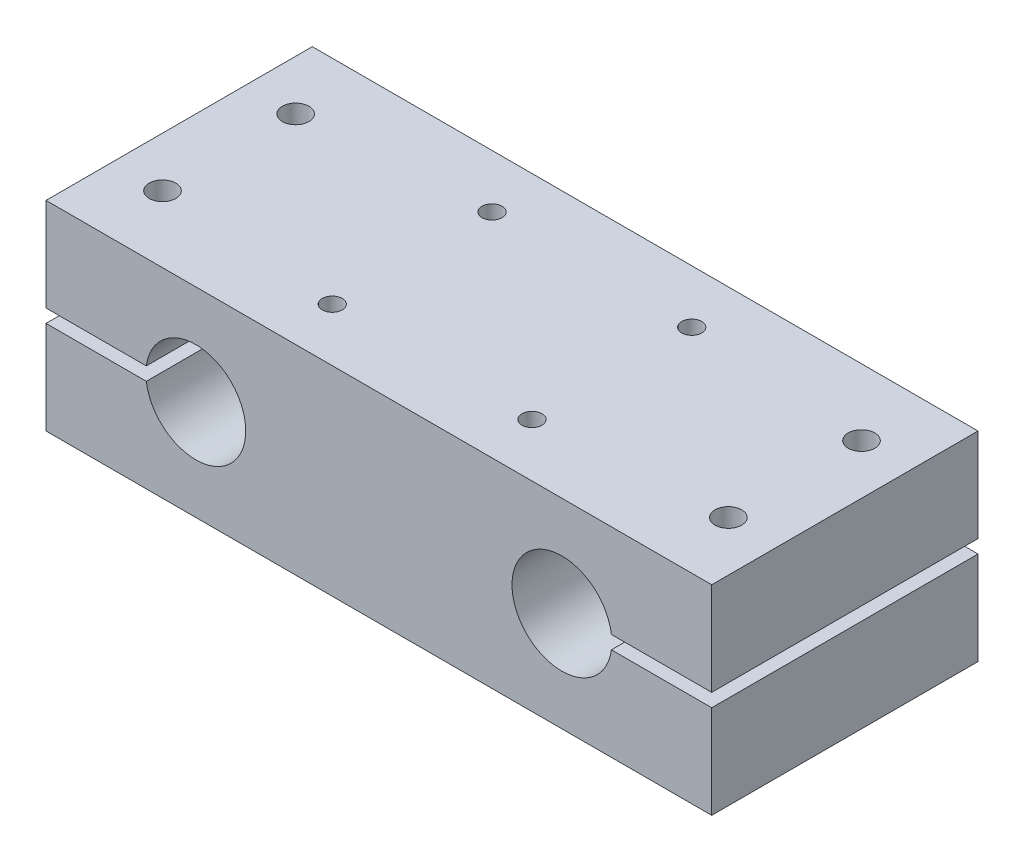
ISO-10303-21;
HEADER;
FILE_DESCRIPTION(('STEP AP214'),'2;1');
FILE_NAME('part.step','',(''),(''),'','','');
FILE_SCHEMA(('AUTOMOTIVE_DESIGN { 1 0 10303 214 1 1 1 1 }'));
ENDSEC;
DATA;
#1=APPLICATION_CONTEXT('core data for automotive mechanical design processes');
#2=APPLICATION_PROTOCOL_DEFINITION('international standard','automotive_design',2000,#1);
#3=PRODUCT_CONTEXT('',#1,'mechanical');
#4=PRODUCT('Part','Part','',(#3));
#5=PRODUCT_RELATED_PRODUCT_CATEGORY('part','',(#4));
#6=PRODUCT_DEFINITION_FORMATION('','',#4);
#7=PRODUCT_DEFINITION_CONTEXT('part definition',#1,'design');
#8=PRODUCT_DEFINITION('design','',#6,#7);
#9=PRODUCT_DEFINITION_SHAPE('','',#8);
#10=(LENGTH_UNIT() NAMED_UNIT(*) SI_UNIT(.MILLI.,.METRE.));
#11=(NAMED_UNIT(*) PLANE_ANGLE_UNIT() SI_UNIT($,.RADIAN.));
#12=(NAMED_UNIT(*) SI_UNIT($,.STERADIAN.) SOLID_ANGLE_UNIT());
#13=UNCERTAINTY_MEASURE_WITH_UNIT(LENGTH_MEASURE(1.E-05),#10,'distance_accuracy_value','');
#14=(GEOMETRIC_REPRESENTATION_CONTEXT(3) GLOBAL_UNCERTAINTY_ASSIGNED_CONTEXT((#13)) GLOBAL_UNIT_ASSIGNED_CONTEXT((#10,
#11,#12)) REPRESENTATION_CONTEXT('',''));
#15=CARTESIAN_POINT('',(0.,0.,0.));
#16=DIRECTION('',(0.,0.,1.));
#17=DIRECTION('',(1.,0.,0.));
#18=AXIS2_PLACEMENT_3D('',#15,#16,#17);
#19=CARTESIAN_POINT('',(0.,0.,40.));
#20=DIRECTION('',(1.,0.,0.));
#21=DIRECTION('',(0.,1.,0.));
#22=AXIS2_PLACEMENT_3D('',#19,#20,#21);
#23=PLANE('',#22);
#24=DIRECTION('',(0.,-1.,0.));
#25=VECTOR('',#24,1.);
#26=CARTESIAN_POINT('',(0.,0.,0.));
#27=LINE('',#26,#25);
#28=CARTESIAN_POINT('',(0.,14.,0.));
#29=VERTEX_POINT('',#28);
#30=CARTESIAN_POINT('',(0.,0.,0.));
#31=VERTEX_POINT('',#30);
#32=EDGE_CURVE('E157',#29,#31,#27,.T.);
#33=ORIENTED_EDGE('',*,*,#32,.T.);
#34=DIRECTION('',(0.,0.,-1.));
#35=VECTOR('',#34,1.);
#36=CARTESIAN_POINT('',(0.,0.,40.));
#37=LINE('',#36,#35);
#38=CARTESIAN_POINT('',(0.,0.,40.));
#39=VERTEX_POINT('',#38);
#40=EDGE_CURVE('E11',#39,#31,#37,.T.);
#41=ORIENTED_EDGE('',*,*,#40,.F.);
#42=DIRECTION('',(0.,-1.,0.));
#43=VECTOR('',#42,1.);
#44=CARTESIAN_POINT('',(0.,0.,40.));
#45=LINE('',#44,#43);
#46=CARTESIAN_POINT('',(0.,14.,40.));
#47=VERTEX_POINT('',#46);
#48=EDGE_CURVE('E180',#47,#39,#45,.T.);
#49=ORIENTED_EDGE('',*,*,#48,.F.);
#50=DIRECTION('',(0.,0.,-1.));
#51=VECTOR('',#50,1.);
#52=CARTESIAN_POINT('',(0.,14.,40.));
#53=LINE('',#52,#51);
#54=EDGE_CURVE('E153',#47,#29,#53,.T.);
#55=ORIENTED_EDGE('',*,*,#54,.T.);
#56=EDGE_LOOP('',(#33,#41,#49,#55));
#57=FACE_BOUND('',#56,.T.);
#58=ADVANCED_FACE('F35',(#57),#23,.F.);
#59=CARTESIAN_POINT('',(0.,0.,40.));
#60=DIRECTION('',(0.,1.,0.));
#61=DIRECTION('',(0.,0.,1.));
#62=AXIS2_PLACEMENT_3D('',#59,#60,#61);
#63=PLANE('',#62);
#64=CARTESIAN_POINT('',(65.,0.,32.));
#65=DIRECTION('',(0.,-1.,0.));
#66=DIRECTION('',(0.,0.,-1.));
#67=AXIS2_PLACEMENT_3D('',#64,#65,#66);
#68=CIRCLE('',#67,1.5);
#69=CARTESIAN_POINT('',(65.,0.,30.5));
#70=VERTEX_POINT('',#69);
#71=EDGE_CURVE('E438',#70,#70,#68,.T.);
#72=ORIENTED_EDGE('',*,*,#71,.F.);
#73=EDGE_LOOP('',(#72));
#74=FACE_BOUND('',#73,.T.);
#75=CARTESIAN_POINT('',(65.,0.,8.));
#76=DIRECTION('',(0.,-1.,0.));
#77=DIRECTION('',(0.,0.,-1.));
#78=AXIS2_PLACEMENT_3D('',#75,#76,#77);
#79=CIRCLE('',#78,1.5);
#80=CARTESIAN_POINT('',(65.,0.,6.5));
#81=VERTEX_POINT('',#80);
#82=EDGE_CURVE('E442',#81,#81,#79,.T.);
#83=ORIENTED_EDGE('',*,*,#82,.F.);
#84=EDGE_LOOP('',(#83));
#85=FACE_BOUND('',#84,.T.);
#86=CARTESIAN_POINT('',(35.,0.,8.));
#87=DIRECTION('',(0.,-1.,0.));
#88=DIRECTION('',(0.,0.,-1.));
#89=AXIS2_PLACEMENT_3D('',#86,#87,#88);
#90=CIRCLE('',#89,1.5);
#91=CARTESIAN_POINT('',(35.,0.,6.5));
#92=VERTEX_POINT('',#91);
#93=EDGE_CURVE('E449',#92,#92,#90,.T.);
#94=ORIENTED_EDGE('',*,*,#93,.F.);
#95=EDGE_LOOP('',(#94));
#96=FACE_BOUND('',#95,.T.);
#97=CARTESIAN_POINT('',(35.,0.,32.));
#98=DIRECTION('',(0.,-1.,0.));
#99=DIRECTION('',(0.,0.,-1.));
#100=AXIS2_PLACEMENT_3D('',#97,#98,#99);
#101=CIRCLE('',#100,1.5);
#102=CARTESIAN_POINT('',(35.,0.,30.5));
#103=VERTEX_POINT('',#102);
#104=EDGE_CURVE('E455',#103,#103,#101,.T.);
#105=ORIENTED_EDGE('',*,*,#104,.F.);
#106=EDGE_LOOP('',(#105));
#107=FACE_BOUND('',#106,.T.);
#108=CARTESIAN_POINT('',(92.5,0.,30.));
#109=DIRECTION('',(0.,-1.,0.));
#110=DIRECTION('',(0.,0.,-1.));
#111=AXIS2_PLACEMENT_3D('',#108,#109,#110);
#112=CIRCLE('',#111,2.);
#113=CARTESIAN_POINT('',(92.5,0.,28.));
#114=VERTEX_POINT('',#113);
#115=EDGE_CURVE('E461',#114,#114,#112,.T.);
#116=ORIENTED_EDGE('',*,*,#115,.F.);
#117=EDGE_LOOP('',(#116));
#118=FACE_BOUND('',#117,.T.);
#119=CARTESIAN_POINT('',(92.5,0.,10.));
#120=DIRECTION('',(0.,-1.,0.));
#121=DIRECTION('',(0.,0.,-1.));
#122=AXIS2_PLACEMENT_3D('',#119,#120,#121);
#123=CIRCLE('',#122,2.);
#124=CARTESIAN_POINT('',(92.5,0.,8.));
#125=VERTEX_POINT('',#124);
#126=EDGE_CURVE('E473',#125,#125,#123,.T.);
#127=ORIENTED_EDGE('',*,*,#126,.F.);
#128=EDGE_LOOP('',(#127));
#129=FACE_BOUND('',#128,.T.);
#130=CARTESIAN_POINT('',(7.5,0.,10.));
#131=DIRECTION('',(0.,-1.,0.));
#132=DIRECTION('',(0.,0.,-1.));
#133=AXIS2_PLACEMENT_3D('',#130,#131,#132);
#134=CIRCLE('',#133,2.);
#135=CARTESIAN_POINT('',(7.5,0.,8.));
#136=VERTEX_POINT('',#135);
#137=EDGE_CURVE('E485',#136,#136,#134,.T.);
#138=ORIENTED_EDGE('',*,*,#137,.F.);
#139=EDGE_LOOP('',(#138));
#140=FACE_BOUND('',#139,.T.);
#141=CARTESIAN_POINT('',(7.5,0.,30.));
#142=DIRECTION('',(0.,-1.,0.));
#143=DIRECTION('',(0.,0.,-1.));
#144=AXIS2_PLACEMENT_3D('',#141,#142,#143);
#145=CIRCLE('',#144,2.);
#146=CARTESIAN_POINT('',(7.5,0.,28.));
#147=VERTEX_POINT('',#146);
#148=EDGE_CURVE('E211',#147,#147,#145,.T.);
#149=ORIENTED_EDGE('',*,*,#148,.F.);
#150=EDGE_LOOP('',(#149));
#151=FACE_BOUND('',#150,.T.);
#152=DIRECTION('',(1.,0.,0.));
#153=VECTOR('',#152,1.);
#154=CARTESIAN_POINT('',(0.,0.,0.));
#155=LINE('',#154,#153);
#156=CARTESIAN_POINT('',(100.,0.,0.));
#157=VERTEX_POINT('',#156);
#158=EDGE_CURVE('E160',#31,#157,#155,.T.);
#159=ORIENTED_EDGE('',*,*,#158,.T.);
#160=DIRECTION('',(0.,0.,-1.));
#161=VECTOR('',#160,1.);
#162=CARTESIAN_POINT('',(100.,0.,40.));
#163=LINE('',#162,#161);
#164=CARTESIAN_POINT('',(100.,0.,40.));
#165=VERTEX_POINT('',#164);
#166=EDGE_CURVE('E44',#165,#157,#163,.T.);
#167=ORIENTED_EDGE('',*,*,#166,.F.);
#168=DIRECTION('',(1.,0.,0.));
#169=VECTOR('',#168,1.);
#170=CARTESIAN_POINT('',(0.,0.,40.));
#171=LINE('',#170,#169);
#172=EDGE_CURVE('E108',#39,#165,#171,.T.);
#173=ORIENTED_EDGE('',*,*,#172,.F.);
#174=ORIENTED_EDGE('',*,*,#40,.T.);
#175=EDGE_LOOP('',(#159,#167,#173,#174));
#176=FACE_BOUND('',#175,.T.);
#177=ADVANCED_FACE('F264',(#74,#85,#96,#107,#118,#129,#140,#151,#176),#63,.F.);
#178=CARTESIAN_POINT('',(100.,0.,40.));
#179=DIRECTION('',(-1.,0.,0.));
#180=DIRECTION('',(0.,0.,1.));
#181=AXIS2_PLACEMENT_3D('',#178,#179,#180);
#182=PLANE('',#181);
#183=DIRECTION('',(0.,1.,0.));
#184=VECTOR('',#183,1.);
#185=CARTESIAN_POINT('',(100.,0.,0.));
#186=LINE('',#185,#184);
#187=CARTESIAN_POINT('',(100.,14.,0.));
#188=VERTEX_POINT('',#187);
#189=EDGE_CURVE('E163',#157,#188,#186,.T.);
#190=ORIENTED_EDGE('',*,*,#189,.T.);
#191=DIRECTION('',(0.,0.,-1.));
#192=VECTOR('',#191,1.);
#193=CARTESIAN_POINT('',(100.,14.,40.));
#194=LINE('',#193,#192);
#195=CARTESIAN_POINT('',(100.,14.,40.));
#196=VERTEX_POINT('',#195);
#197=EDGE_CURVE('E199',#196,#188,#194,.T.);
#198=ORIENTED_EDGE('',*,*,#197,.F.);
#199=DIRECTION('',(0.,1.,0.));
#200=VECTOR('',#199,1.);
#201=CARTESIAN_POINT('',(100.,0.,40.));
#202=LINE('',#201,#200);
#203=EDGE_CURVE('E223',#165,#196,#202,.T.);
#204=ORIENTED_EDGE('',*,*,#203,.F.);
#205=ORIENTED_EDGE('',*,*,#166,.T.);
#206=EDGE_LOOP('',(#190,#198,#204,#205));
#207=FACE_BOUND('',#206,.T.);
#208=ADVANCED_FACE('F268',(#207),#182,.F.);
#209=CARTESIAN_POINT('',(100.,14.,40.));
#210=DIRECTION('',(0.,-1.,0.));
#211=DIRECTION('',(0.,0.,-1.));
#212=AXIS2_PLACEMENT_3D('',#209,#210,#211);
#213=PLANE('',#212);
#214=CARTESIAN_POINT('',(92.5,14.,30.));
#215=DIRECTION('',(0.,-1.,0.));
#216=DIRECTION('',(0.,0.,-1.));
#217=AXIS2_PLACEMENT_3D('',#214,#215,#216);
#218=CIRCLE('',#217,2.);
#219=CARTESIAN_POINT('',(92.5,14.,28.));
#220=VERTEX_POINT('',#219);
#221=EDGE_CURVE('E469',#220,#220,#218,.T.);
#222=ORIENTED_EDGE('',*,*,#221,.T.);
#223=EDGE_LOOP('',(#222));
#224=FACE_BOUND('',#223,.T.);
#225=CARTESIAN_POINT('',(92.5,14.,10.));
#226=DIRECTION('',(0.,-1.,0.));
#227=DIRECTION('',(0.,0.,-1.));
#228=AXIS2_PLACEMENT_3D('',#225,#226,#227);
#229=CIRCLE('',#228,2.);
#230=CARTESIAN_POINT('',(92.5,14.,8.));
#231=VERTEX_POINT('',#230);
#232=EDGE_CURVE('E481',#231,#231,#229,.T.);
#233=ORIENTED_EDGE('',*,*,#232,.T.);
#234=EDGE_LOOP('',(#233));
#235=FACE_BOUND('',#234,.T.);
#236=DIRECTION('',(-1.,0.,0.));
#237=VECTOR('',#236,1.);
#238=CARTESIAN_POINT('',(100.,14.,0.));
#239=LINE('',#238,#237);
#240=CARTESIAN_POINT('',(84.9330343736593,14.,0.));
#241=VERTEX_POINT('',#240);
#242=EDGE_CURVE('E165',#188,#241,#239,.T.);
#243=ORIENTED_EDGE('',*,*,#242,.T.);
#244=DIRECTION('',(0.,0.,-1.));
#245=VECTOR('',#244,1.);
#246=CARTESIAN_POINT('',(84.9330343736593,14.,40.));
#247=LINE('',#246,#245);
#248=CARTESIAN_POINT('',(84.9330343736593,14.,40.));
#249=VERTEX_POINT('',#248);
#250=EDGE_CURVE('E196',#249,#241,#247,.T.);
#251=ORIENTED_EDGE('',*,*,#250,.F.);
#252=DIRECTION('',(-1.,0.,0.));
#253=VECTOR('',#252,1.);
#254=CARTESIAN_POINT('',(100.,14.,40.));
#255=LINE('',#254,#253);
#256=EDGE_CURVE('E225',#196,#249,#255,.T.);
#257=ORIENTED_EDGE('',*,*,#256,.F.);
#258=ORIENTED_EDGE('',*,*,#197,.T.);
#259=EDGE_LOOP('',(#243,#251,#257,#258));
#260=FACE_BOUND('',#259,.T.);
#261=ADVANCED_FACE('F273',(#224,#235,#260),#213,.F.);
#262=CARTESIAN_POINT('',(77.5,15.,40.));
#263=DIRECTION('',(0.,0.,-1.));
#264=DIRECTION('',(-1.,0.,0.));
#265=AXIS2_PLACEMENT_3D('',#262,#263,#264);
#266=CYLINDRICAL_SURFACE('',#265,7.50000000000001);
#267=CARTESIAN_POINT('',(77.5,15.,0.));
#268=DIRECTION('',(0.,0.,-1.));
#269=DIRECTION('',(1.,0.,0.));
#270=AXIS2_PLACEMENT_3D('',#267,#268,#269);
#271=CIRCLE('',#270,7.50000000000001);
#272=CARTESIAN_POINT('',(84.9330343736593,16.,0.));
#273=VERTEX_POINT('',#272);
#274=EDGE_CURVE('E167',#241,#273,#271,.T.);
#275=ORIENTED_EDGE('',*,*,#274,.T.);
#276=DIRECTION('',(0.,0.,-1.));
#277=VECTOR('',#276,1.);
#278=CARTESIAN_POINT('',(84.9330343736593,16.,40.));
#279=LINE('',#278,#277);
#280=CARTESIAN_POINT('',(84.9330343736593,16.,40.));
#281=VERTEX_POINT('',#280);
#282=EDGE_CURVE('E193',#281,#273,#279,.T.);
#283=ORIENTED_EDGE('',*,*,#282,.F.);
#284=CARTESIAN_POINT('',(77.5,15.,40.));
#285=DIRECTION('',(0.,0.,-1.));
#286=DIRECTION('',(1.,0.,0.));
#287=AXIS2_PLACEMENT_3D('',#284,#285,#286);
#288=CIRCLE('',#287,7.50000000000001);
#289=EDGE_CURVE('E227',#249,#281,#288,.T.);
#290=ORIENTED_EDGE('',*,*,#289,.F.);
#291=ORIENTED_EDGE('',*,*,#250,.T.);
#292=EDGE_LOOP('',(#275,#283,#290,#291));
#293=FACE_BOUND('',#292,.T.);
#294=ADVANCED_FACE('F281',(#293),#266,.F.);
#295=CARTESIAN_POINT('',(100.,16.,40.));
#296=DIRECTION('',(0.,1.,0.));
#297=DIRECTION('',(0.,0.,1.));
#298=AXIS2_PLACEMENT_3D('',#295,#296,#297);
#299=PLANE('',#298);
#300=CARTESIAN_POINT('',(92.5,16.,30.));
#301=DIRECTION('',(0.,1.,0.));
#302=DIRECTION('',(0.,0.,1.));
#303=AXIS2_PLACEMENT_3D('',#300,#301,#302);
#304=CIRCLE('',#303,2.);
#305=CARTESIAN_POINT('',(92.5,16.,32.));
#306=VERTEX_POINT('',#305);
#307=EDGE_CURVE('E464',#306,#306,#304,.T.);
#308=ORIENTED_EDGE('',*,*,#307,.T.);
#309=EDGE_LOOP('',(#308));
#310=FACE_BOUND('',#309,.T.);
#311=CARTESIAN_POINT('',(92.5,16.,10.));
#312=DIRECTION('',(0.,1.,0.));
#313=DIRECTION('',(0.,0.,1.));
#314=AXIS2_PLACEMENT_3D('',#311,#312,#313);
#315=CIRCLE('',#314,2.);
#316=CARTESIAN_POINT('',(92.5,16.,12.));
#317=VERTEX_POINT('',#316);
#318=EDGE_CURVE('E476',#317,#317,#315,.T.);
#319=ORIENTED_EDGE('',*,*,#318,.T.);
#320=EDGE_LOOP('',(#319));
#321=FACE_BOUND('',#320,.T.);
#322=DIRECTION('',(1.,0.,0.));
#323=VECTOR('',#322,1.);
#324=CARTESIAN_POINT('',(100.,16.,0.));
#325=LINE('',#324,#323);
#326=CARTESIAN_POINT('',(100.,16.,0.));
#327=VERTEX_POINT('',#326);
#328=EDGE_CURVE('E169',#273,#327,#325,.T.);
#329=ORIENTED_EDGE('',*,*,#328,.T.);
#330=DIRECTION('',(0.,0.,-1.));
#331=VECTOR('',#330,1.);
#332=CARTESIAN_POINT('',(100.,16.,40.));
#333=LINE('',#332,#331);
#334=CARTESIAN_POINT('',(100.,16.,40.));
#335=VERTEX_POINT('',#334);
#336=EDGE_CURVE('E190',#335,#327,#333,.T.);
#337=ORIENTED_EDGE('',*,*,#336,.F.);
#338=DIRECTION('',(1.,0.,0.));
#339=VECTOR('',#338,1.);
#340=CARTESIAN_POINT('',(100.,16.,40.));
#341=LINE('',#340,#339);
#342=EDGE_CURVE('E229',#281,#335,#341,.T.);
#343=ORIENTED_EDGE('',*,*,#342,.F.);
#344=ORIENTED_EDGE('',*,*,#282,.T.);
#345=EDGE_LOOP('',(#329,#337,#343,#344));
#346=FACE_BOUND('',#345,.T.);
#347=ADVANCED_FACE('F285',(#310,#321,#346),#299,.F.);
#348=CARTESIAN_POINT('',(100.,16.,40.));
#349=DIRECTION('',(-1.,0.,0.));
#350=DIRECTION('',(0.,0.,1.));
#351=AXIS2_PLACEMENT_3D('',#348,#349,#350);
#352=PLANE('',#351);
#353=DIRECTION('',(0.,1.,0.));
#354=VECTOR('',#353,1.);
#355=CARTESIAN_POINT('',(100.,16.,0.));
#356=LINE('',#355,#354);
#357=CARTESIAN_POINT('',(100.,30.,0.));
#358=VERTEX_POINT('',#357);
#359=EDGE_CURVE('E171',#327,#358,#356,.T.);
#360=ORIENTED_EDGE('',*,*,#359,.T.);
#361=DIRECTION('',(0.,0.,-1.));
#362=VECTOR('',#361,1.);
#363=CARTESIAN_POINT('',(100.,30.,40.));
#364=LINE('',#363,#362);
#365=CARTESIAN_POINT('',(100.,30.,40.));
#366=VERTEX_POINT('',#365);
#367=EDGE_CURVE('E187',#366,#358,#364,.T.);
#368=ORIENTED_EDGE('',*,*,#367,.F.);
#369=DIRECTION('',(0.,1.,0.));
#370=VECTOR('',#369,1.);
#371=CARTESIAN_POINT('',(100.,16.,40.));
#372=LINE('',#371,#370);
#373=EDGE_CURVE('E231',#335,#366,#372,.T.);
#374=ORIENTED_EDGE('',*,*,#373,.F.);
#375=ORIENTED_EDGE('',*,*,#336,.T.);
#376=EDGE_LOOP('',(#360,#368,#374,#375));
#377=FACE_BOUND('',#376,.T.);
#378=ADVANCED_FACE('F289',(#377),#352,.F.);
#379=CARTESIAN_POINT('',(0.,30.,40.));
#380=DIRECTION('',(0.,-1.,0.));
#381=DIRECTION('',(0.,0.,-1.));
#382=AXIS2_PLACEMENT_3D('',#379,#380,#381);
#383=PLANE('',#382);
#384=CARTESIAN_POINT('',(65.,30.,32.));
#385=DIRECTION('',(0.,-1.,0.));
#386=DIRECTION('',(0.,0.,-1.));
#387=AXIS2_PLACEMENT_3D('',#384,#385,#386);
#388=CIRCLE('',#387,1.5);
#389=CARTESIAN_POINT('',(65.,30.,30.5));
#390=VERTEX_POINT('',#389);
#391=EDGE_CURVE('E436',#390,#390,#388,.T.);
#392=ORIENTED_EDGE('',*,*,#391,.T.);
#393=EDGE_LOOP('',(#392));
#394=FACE_BOUND('',#393,.T.);
#395=CARTESIAN_POINT('',(65.,30.,8.));
#396=DIRECTION('',(0.,-1.,0.));
#397=DIRECTION('',(0.,0.,-1.));
#398=AXIS2_PLACEMENT_3D('',#395,#396,#397);
#399=CIRCLE('',#398,1.5);
#400=CARTESIAN_POINT('',(65.,30.,6.5));
#401=VERTEX_POINT('',#400);
#402=EDGE_CURVE('E439',#401,#401,#399,.T.);
#403=ORIENTED_EDGE('',*,*,#402,.T.);
#404=EDGE_LOOP('',(#403));
#405=FACE_BOUND('',#404,.T.);
#406=CARTESIAN_POINT('',(35.,30.,8.));
#407=DIRECTION('',(0.,-1.,0.));
#408=DIRECTION('',(0.,0.,-1.));
#409=AXIS2_PLACEMENT_3D('',#406,#407,#408);
#410=CIRCLE('',#409,1.5);
#411=CARTESIAN_POINT('',(35.,30.,6.5));
#412=VERTEX_POINT('',#411);
#413=EDGE_CURVE('E447',#412,#412,#410,.T.);
#414=ORIENTED_EDGE('',*,*,#413,.T.);
#415=EDGE_LOOP('',(#414));
#416=FACE_BOUND('',#415,.T.);
#417=CARTESIAN_POINT('',(35.,30.,32.));
#418=DIRECTION('',(0.,-1.,0.));
#419=DIRECTION('',(0.,0.,-1.));
#420=AXIS2_PLACEMENT_3D('',#417,#418,#419);
#421=CIRCLE('',#420,1.5);
#422=CARTESIAN_POINT('',(35.,30.,30.5));
#423=VERTEX_POINT('',#422);
#424=EDGE_CURVE('E452',#423,#423,#421,.T.);
#425=ORIENTED_EDGE('',*,*,#424,.T.);
#426=EDGE_LOOP('',(#425));
#427=FACE_BOUND('',#426,.T.);
#428=CARTESIAN_POINT('',(92.5,30.,30.));
#429=DIRECTION('',(0.,-1.,0.));
#430=DIRECTION('',(0.,0.,-1.));
#431=AXIS2_PLACEMENT_3D('',#428,#429,#430);
#432=CIRCLE('',#431,2.);
#433=CARTESIAN_POINT('',(92.5,30.,28.));
#434=VERTEX_POINT('',#433);
#435=EDGE_CURVE('E458',#434,#434,#432,.T.);
#436=ORIENTED_EDGE('',*,*,#435,.T.);
#437=EDGE_LOOP('',(#436));
#438=FACE_BOUND('',#437,.T.);
#439=CARTESIAN_POINT('',(92.5,30.,10.));
#440=DIRECTION('',(0.,-1.,0.));
#441=DIRECTION('',(0.,0.,-1.));
#442=AXIS2_PLACEMENT_3D('',#439,#440,#441);
#443=CIRCLE('',#442,2.);
#444=CARTESIAN_POINT('',(92.5,30.,8.));
#445=VERTEX_POINT('',#444);
#446=EDGE_CURVE('E472',#445,#445,#443,.T.);
#447=ORIENTED_EDGE('',*,*,#446,.T.);
#448=EDGE_LOOP('',(#447));
#449=FACE_BOUND('',#448,.T.);
#450=CARTESIAN_POINT('',(7.5,30.,10.));
#451=DIRECTION('',(0.,-1.,0.));
#452=DIRECTION('',(0.,0.,-1.));
#453=AXIS2_PLACEMENT_3D('',#450,#451,#452);
#454=CIRCLE('',#453,2.);
#455=CARTESIAN_POINT('',(7.5,30.,8.));
#456=VERTEX_POINT('',#455);
#457=EDGE_CURVE('E484',#456,#456,#454,.T.);
#458=ORIENTED_EDGE('',*,*,#457,.T.);
#459=EDGE_LOOP('',(#458));
#460=FACE_BOUND('',#459,.T.);
#461=CARTESIAN_POINT('',(7.5,30.,30.));
#462=DIRECTION('',(0.,-1.,0.));
#463=DIRECTION('',(0.,0.,-1.));
#464=AXIS2_PLACEMENT_3D('',#461,#462,#463);
#465=CIRCLE('',#464,2.);
#466=CARTESIAN_POINT('',(7.5,30.,28.));
#467=VERTEX_POINT('',#466);
#468=EDGE_CURVE('E205',#467,#467,#465,.T.);
#469=ORIENTED_EDGE('',*,*,#468,.T.);
#470=EDGE_LOOP('',(#469));
#471=FACE_BOUND('',#470,.T.);
#472=DIRECTION('',(-1.,0.,0.));
#473=VECTOR('',#472,1.);
#474=CARTESIAN_POINT('',(0.,30.,0.));
#475=LINE('',#474,#473);
#476=CARTESIAN_POINT('',(0.,30.,0.));
#477=VERTEX_POINT('',#476);
#478=EDGE_CURVE('E173',#358,#477,#475,.T.);
#479=ORIENTED_EDGE('',*,*,#478,.T.);
#480=DIRECTION('',(0.,0.,-1.));
#481=VECTOR('',#480,1.);
#482=CARTESIAN_POINT('',(0.,30.,40.));
#483=LINE('',#482,#481);
#484=CARTESIAN_POINT('',(0.,30.,40.));
#485=VERTEX_POINT('',#484);
#486=EDGE_CURVE('E184',#485,#477,#483,.T.);
#487=ORIENTED_EDGE('',*,*,#486,.F.);
#488=DIRECTION('',(-1.,0.,0.));
#489=VECTOR('',#488,1.);
#490=CARTESIAN_POINT('',(0.,30.,40.));
#491=LINE('',#490,#489);
#492=EDGE_CURVE('E233',#366,#485,#491,.T.);
#493=ORIENTED_EDGE('',*,*,#492,.F.);
#494=ORIENTED_EDGE('',*,*,#367,.T.);
#495=EDGE_LOOP('',(#479,#487,#493,#494));
#496=FACE_BOUND('',#495,.T.);
#497=ADVANCED_FACE('F239',(#394,#405,#416,#427,#438,#449,#460,#471,#496),#383,.F.);
#498=CARTESIAN_POINT('',(0.,16.,40.));
#499=DIRECTION('',(1.,0.,0.));
#500=DIRECTION('',(0.,0.,-1.));
#501=AXIS2_PLACEMENT_3D('',#498,#499,#500);
#502=PLANE('',#501);
#503=DIRECTION('',(0.,-1.,0.));
#504=VECTOR('',#503,1.);
#505=CARTESIAN_POINT('',(0.,16.,0.));
#506=LINE('',#505,#504);
#507=CARTESIAN_POINT('',(0.,16.,0.));
#508=VERTEX_POINT('',#507);
#509=EDGE_CURVE('E175',#477,#508,#506,.T.);
#510=ORIENTED_EDGE('',*,*,#509,.T.);
#511=DIRECTION('',(0.,0.,-1.));
#512=VECTOR('',#511,1.);
#513=CARTESIAN_POINT('',(0.,16.,40.));
#514=LINE('',#513,#512);
#515=CARTESIAN_POINT('',(0.,16.,40.));
#516=VERTEX_POINT('',#515);
#517=EDGE_CURVE('E148',#516,#508,#514,.T.);
#518=ORIENTED_EDGE('',*,*,#517,.F.);
#519=DIRECTION('',(0.,-1.,0.));
#520=VECTOR('',#519,1.);
#521=CARTESIAN_POINT('',(0.,16.,40.));
#522=LINE('',#521,#520);
#523=EDGE_CURVE('E139',#485,#516,#522,.T.);
#524=ORIENTED_EDGE('',*,*,#523,.F.);
#525=ORIENTED_EDGE('',*,*,#486,.T.);
#526=EDGE_LOOP('',(#510,#518,#524,#525));
#527=FACE_BOUND('',#526,.T.);
#528=ADVANCED_FACE('F243',(#527),#502,.F.);
#529=CARTESIAN_POINT('',(0.,16.,40.));
#530=DIRECTION('',(0.,1.,0.));
#531=DIRECTION('',(0.,0.,1.));
#532=AXIS2_PLACEMENT_3D('',#529,#530,#531);
#533=PLANE('',#532);
#534=CARTESIAN_POINT('',(7.5,16.,10.));
#535=DIRECTION('',(0.,1.,0.));
#536=DIRECTION('',(0.,0.,1.));
#537=AXIS2_PLACEMENT_3D('',#534,#535,#536);
#538=CIRCLE('',#537,2.);
#539=CARTESIAN_POINT('',(7.5,16.,12.));
#540=VERTEX_POINT('',#539);
#541=EDGE_CURVE('E216',#540,#540,#538,.T.);
#542=ORIENTED_EDGE('',*,*,#541,.T.);
#543=EDGE_LOOP('',(#542));
#544=FACE_BOUND('',#543,.T.);
#545=CARTESIAN_POINT('',(7.5,16.,30.));
#546=DIRECTION('',(0.,1.,0.));
#547=DIRECTION('',(0.,0.,1.));
#548=AXIS2_PLACEMENT_3D('',#545,#546,#547);
#549=CIRCLE('',#548,2.);
#550=CARTESIAN_POINT('',(7.5,16.,32.));
#551=VERTEX_POINT('',#550);
#552=EDGE_CURVE('E161',#551,#551,#549,.T.);
#553=ORIENTED_EDGE('',*,*,#552,.T.);
#554=EDGE_LOOP('',(#553));
#555=FACE_BOUND('',#554,.T.);
#556=DIRECTION('',(1.,0.,0.));
#557=VECTOR('',#556,1.);
#558=CARTESIAN_POINT('',(0.,16.,0.));
#559=LINE('',#558,#557);
#560=CARTESIAN_POINT('',(15.0669656263407,16.,0.));
#561=VERTEX_POINT('',#560);
#562=EDGE_CURVE('E147',#508,#561,#559,.T.);
#563=ORIENTED_EDGE('',*,*,#562,.T.);
#564=DIRECTION('',(0.,0.,-1.));
#565=VECTOR('',#564,1.);
#566=CARTESIAN_POINT('',(15.0669656263407,16.,40.));
#567=LINE('',#566,#565);
#568=CARTESIAN_POINT('',(15.0669656263407,16.,40.));
#569=VERTEX_POINT('',#568);
#570=EDGE_CURVE('E144',#569,#561,#567,.T.);
#571=ORIENTED_EDGE('',*,*,#570,.F.);
#572=DIRECTION('',(1.,0.,0.));
#573=VECTOR('',#572,1.);
#574=CARTESIAN_POINT('',(0.,16.,40.));
#575=LINE('',#574,#573);
#576=EDGE_CURVE('E133',#516,#569,#575,.T.);
#577=ORIENTED_EDGE('',*,*,#576,.F.);
#578=ORIENTED_EDGE('',*,*,#517,.T.);
#579=EDGE_LOOP('',(#563,#571,#577,#578));
#580=FACE_BOUND('',#579,.T.);
#581=ADVANCED_FACE('F145',(#544,#555,#580),#533,.F.);
#582=CARTESIAN_POINT('',(22.5,15.,40.));
#583=DIRECTION('',(0.,0.,-1.));
#584=DIRECTION('',(-1.,0.,0.));
#585=AXIS2_PLACEMENT_3D('',#582,#583,#584);
#586=CYLINDRICAL_SURFACE('',#585,7.5);
#587=CARTESIAN_POINT('',(22.5,15.,0.));
#588=DIRECTION('',(0.,0.,-1.));
#589=DIRECTION('',(1.,0.,0.));
#590=AXIS2_PLACEMENT_3D('',#587,#588,#589);
#591=CIRCLE('',#590,7.5);
#592=CARTESIAN_POINT('',(15.0669656263407,14.,0.));
#593=VERTEX_POINT('',#592);
#594=EDGE_CURVE('E94',#561,#593,#591,.T.);
#595=ORIENTED_EDGE('',*,*,#594,.T.);
#596=DIRECTION('',(0.,0.,-1.));
#597=VECTOR('',#596,1.);
#598=CARTESIAN_POINT('',(15.0669656263407,14.,40.));
#599=LINE('',#598,#597);
#600=CARTESIAN_POINT('',(15.0669656263407,14.,40.));
#601=VERTEX_POINT('',#600);
#602=EDGE_CURVE('E149',#601,#593,#599,.T.);
#603=ORIENTED_EDGE('',*,*,#602,.F.);
#604=CARTESIAN_POINT('',(22.5,15.,40.));
#605=DIRECTION('',(0.,0.,-1.));
#606=DIRECTION('',(1.,0.,0.));
#607=AXIS2_PLACEMENT_3D('',#604,#605,#606);
#608=CIRCLE('',#607,7.5);
#609=EDGE_CURVE('E137',#569,#601,#608,.T.);
#610=ORIENTED_EDGE('',*,*,#609,.F.);
#611=ORIENTED_EDGE('',*,*,#570,.T.);
#612=EDGE_LOOP('',(#595,#603,#610,#611));
#613=FACE_BOUND('',#612,.T.);
#614=ADVANCED_FACE('F151',(#613),#586,.F.);
#615=CARTESIAN_POINT('',(0.,14.,40.));
#616=DIRECTION('',(0.,-1.,0.));
#617=DIRECTION('',(0.,0.,-1.));
#618=AXIS2_PLACEMENT_3D('',#615,#616,#617);
#619=PLANE('',#618);
#620=CARTESIAN_POINT('',(7.5,14.,10.));
#621=DIRECTION('',(0.,-1.,0.));
#622=DIRECTION('',(0.,0.,-1.));
#623=AXIS2_PLACEMENT_3D('',#620,#621,#622);
#624=CIRCLE('',#623,2.);
#625=CARTESIAN_POINT('',(7.5,14.,8.));
#626=VERTEX_POINT('',#625);
#627=EDGE_CURVE('E38',#626,#626,#624,.T.);
#628=ORIENTED_EDGE('',*,*,#627,.T.);
#629=EDGE_LOOP('',(#628));
#630=FACE_BOUND('',#629,.T.);
#631=CARTESIAN_POINT('',(7.5,14.,30.));
#632=DIRECTION('',(0.,-1.,0.));
#633=DIRECTION('',(0.,0.,-1.));
#634=AXIS2_PLACEMENT_3D('',#631,#632,#633);
#635=CIRCLE('',#634,2.);
#636=CARTESIAN_POINT('',(7.5,14.,28.));
#637=VERTEX_POINT('',#636);
#638=EDGE_CURVE('E203',#637,#637,#635,.T.);
#639=ORIENTED_EDGE('',*,*,#638,.T.);
#640=EDGE_LOOP('',(#639));
#641=FACE_BOUND('',#640,.T.);
#642=DIRECTION('',(-1.,0.,0.));
#643=VECTOR('',#642,1.);
#644=CARTESIAN_POINT('',(0.,14.,0.));
#645=LINE('',#644,#643);
#646=EDGE_CURVE('E100',#593,#29,#645,.T.);
#647=ORIENTED_EDGE('',*,*,#646,.T.);
#648=ORIENTED_EDGE('',*,*,#54,.F.);
#649=DIRECTION('',(-1.,0.,0.));
#650=VECTOR('',#649,1.);
#651=CARTESIAN_POINT('',(0.,14.,40.));
#652=LINE('',#651,#650);
#653=EDGE_CURVE('E53',#601,#47,#652,.T.);
#654=ORIENTED_EDGE('',*,*,#653,.F.);
#655=ORIENTED_EDGE('',*,*,#602,.T.);
#656=EDGE_LOOP('',(#647,#648,#654,#655));
#657=FACE_BOUND('',#656,.T.);
#658=ADVANCED_FACE('F251',(#630,#641,#657),#619,.F.);
#659=CARTESIAN_POINT('',(22.5,15.,40.));
#660=DIRECTION('',(0.,0.,1.));
#661=DIRECTION('',(1.,0.,0.));
#662=AXIS2_PLACEMENT_3D('',#659,#660,#661);
#663=PLANE('',#662);
#664=ORIENTED_EDGE('',*,*,#48,.T.);
#665=ORIENTED_EDGE('',*,*,#172,.T.);
#666=ORIENTED_EDGE('',*,*,#203,.T.);
#667=ORIENTED_EDGE('',*,*,#256,.T.);
#668=ORIENTED_EDGE('',*,*,#289,.T.);
#669=ORIENTED_EDGE('',*,*,#342,.T.);
#670=ORIENTED_EDGE('',*,*,#373,.T.);
#671=ORIENTED_EDGE('',*,*,#492,.T.);
#672=ORIENTED_EDGE('',*,*,#523,.T.);
#673=ORIENTED_EDGE('',*,*,#576,.T.);
#674=ORIENTED_EDGE('',*,*,#609,.T.);
#675=ORIENTED_EDGE('',*,*,#653,.T.);
#676=EDGE_LOOP('',(#664,#665,#666,#667,#668,#669,#670,#671,#672,#673,#674,#675));
#677=FACE_BOUND('',#676,.T.);
#678=ADVANCED_FACE('F135',(#677),#663,.T.);
#679=CARTESIAN_POINT('',(22.5,15.,0.));
#680=DIRECTION('',(0.,0.,1.));
#681=DIRECTION('',(1.,0.,0.));
#682=AXIS2_PLACEMENT_3D('',#679,#680,#681);
#683=PLANE('',#682);
#684=ORIENTED_EDGE('',*,*,#32,.F.);
#685=ORIENTED_EDGE('',*,*,#646,.F.);
#686=ORIENTED_EDGE('',*,*,#594,.F.);
#687=ORIENTED_EDGE('',*,*,#562,.F.);
#688=ORIENTED_EDGE('',*,*,#509,.F.);
#689=ORIENTED_EDGE('',*,*,#478,.F.);
#690=ORIENTED_EDGE('',*,*,#359,.F.);
#691=ORIENTED_EDGE('',*,*,#328,.F.);
#692=ORIENTED_EDGE('',*,*,#274,.F.);
#693=ORIENTED_EDGE('',*,*,#242,.F.);
#694=ORIENTED_EDGE('',*,*,#189,.F.);
#695=ORIENTED_EDGE('',*,*,#158,.F.);
#696=EDGE_LOOP('',(#684,#685,#686,#687,#688,#689,#690,#691,#692,#693,#694,#695));
#697=FACE_BOUND('',#696,.T.);
#698=ADVANCED_FACE('F246',(#697),#683,.F.);
#699=CARTESIAN_POINT('',(7.5,30.,30.));
#700=DIRECTION('',(0.,-1.,0.));
#701=DIRECTION('',(0.,0.,-1.));
#702=AXIS2_PLACEMENT_3D('',#699,#700,#701);
#703=CYLINDRICAL_SURFACE('',#702,2.);
#704=ORIENTED_EDGE('',*,*,#148,.T.);
#705=EDGE_LOOP('',(#704));
#706=FACE_BOUND('',#705,.T.);
#707=ORIENTED_EDGE('',*,*,#638,.F.);
#708=EDGE_LOOP('',(#707));
#709=FACE_BOUND('',#708,.T.);
#710=ADVANCED_FACE('F311',(#706,#709),#703,.F.);
#711=ORIENTED_EDGE('',*,*,#468,.F.);
#712=EDGE_LOOP('',(#711));
#713=FACE_BOUND('',#712,.T.);
#714=ORIENTED_EDGE('',*,*,#552,.F.);
#715=EDGE_LOOP('',(#714));
#716=FACE_BOUND('',#715,.T.);
#717=ADVANCED_FACE('F308',(#713,#716),#703,.F.);
#718=CARTESIAN_POINT('',(7.5,30.,10.));
#719=DIRECTION('',(0.,-1.,0.));
#720=DIRECTION('',(0.,0.,-1.));
#721=AXIS2_PLACEMENT_3D('',#718,#719,#720);
#722=CYLINDRICAL_SURFACE('',#721,2.);
#723=ORIENTED_EDGE('',*,*,#137,.T.);
#724=EDGE_LOOP('',(#723));
#725=FACE_BOUND('',#724,.T.);
#726=ORIENTED_EDGE('',*,*,#627,.F.);
#727=EDGE_LOOP('',(#726));
#728=FACE_BOUND('',#727,.T.);
#729=ADVANCED_FACE('F310',(#725,#728),#722,.F.);
#730=ORIENTED_EDGE('',*,*,#457,.F.);
#731=EDGE_LOOP('',(#730));
#732=FACE_BOUND('',#731,.T.);
#733=ORIENTED_EDGE('',*,*,#541,.F.);
#734=EDGE_LOOP('',(#733));
#735=FACE_BOUND('',#734,.T.);
#736=ADVANCED_FACE('F318',(#732,#735),#722,.F.);
#737=CARTESIAN_POINT('',(92.5,30.,10.));
#738=DIRECTION('',(0.,-1.,0.));
#739=DIRECTION('',(0.,0.,-1.));
#740=AXIS2_PLACEMENT_3D('',#737,#738,#739);
#741=CYLINDRICAL_SURFACE('',#740,2.);
#742=ORIENTED_EDGE('',*,*,#446,.F.);
#743=EDGE_LOOP('',(#742));
#744=FACE_BOUND('',#743,.T.);
#745=ORIENTED_EDGE('',*,*,#318,.F.);
#746=EDGE_LOOP('',(#745));
#747=FACE_BOUND('',#746,.T.);
#748=ADVANCED_FACE('F353',(#744,#747),#741,.F.);
#749=ORIENTED_EDGE('',*,*,#126,.T.);
#750=EDGE_LOOP('',(#749));
#751=FACE_BOUND('',#750,.T.);
#752=ORIENTED_EDGE('',*,*,#232,.F.);
#753=EDGE_LOOP('',(#752));
#754=FACE_BOUND('',#753,.T.);
#755=ADVANCED_FACE('F362',(#751,#754),#741,.F.);
#756=CARTESIAN_POINT('',(92.5,30.,30.));
#757=DIRECTION('',(0.,-1.,0.));
#758=DIRECTION('',(0.,0.,-1.));
#759=AXIS2_PLACEMENT_3D('',#756,#757,#758);
#760=CYLINDRICAL_SURFACE('',#759,2.);
#761=ORIENTED_EDGE('',*,*,#435,.F.);
#762=EDGE_LOOP('',(#761));
#763=FACE_BOUND('',#762,.T.);
#764=ORIENTED_EDGE('',*,*,#307,.F.);
#765=EDGE_LOOP('',(#764));
#766=FACE_BOUND('',#765,.T.);
#767=ADVANCED_FACE('F371',(#763,#766),#760,.F.);
#768=ORIENTED_EDGE('',*,*,#115,.T.);
#769=EDGE_LOOP('',(#768));
#770=FACE_BOUND('',#769,.T.);
#771=ORIENTED_EDGE('',*,*,#221,.F.);
#772=EDGE_LOOP('',(#771));
#773=FACE_BOUND('',#772,.T.);
#774=ADVANCED_FACE('F380',(#770,#773),#760,.F.);
#775=CARTESIAN_POINT('',(35.,30.,32.));
#776=DIRECTION('',(0.,-1.,0.));
#777=DIRECTION('',(0.,0.,-1.));
#778=AXIS2_PLACEMENT_3D('',#775,#776,#777);
#779=CYLINDRICAL_SURFACE('',#778,1.5);
#780=ORIENTED_EDGE('',*,*,#424,.F.);
#781=EDGE_LOOP('',(#780));
#782=FACE_BOUND('',#781,.T.);
#783=ORIENTED_EDGE('',*,*,#104,.T.);
#784=EDGE_LOOP('',(#783));
#785=FACE_BOUND('',#784,.T.);
#786=ADVANCED_FACE('F390',(#782,#785),#779,.F.);
#787=CARTESIAN_POINT('',(35.,30.,8.));
#788=DIRECTION('',(0.,-1.,0.));
#789=DIRECTION('',(0.,0.,-1.));
#790=AXIS2_PLACEMENT_3D('',#787,#788,#789);
#791=CYLINDRICAL_SURFACE('',#790,1.5);
#792=ORIENTED_EDGE('',*,*,#413,.F.);
#793=EDGE_LOOP('',(#792));
#794=FACE_BOUND('',#793,.T.);
#795=ORIENTED_EDGE('',*,*,#93,.T.);
#796=EDGE_LOOP('',(#795));
#797=FACE_BOUND('',#796,.T.);
#798=ADVANCED_FACE('F399',(#794,#797),#791,.F.);
#799=CARTESIAN_POINT('',(65.,30.,8.));
#800=DIRECTION('',(0.,-1.,0.));
#801=DIRECTION('',(0.,0.,-1.));
#802=AXIS2_PLACEMENT_3D('',#799,#800,#801);
#803=CYLINDRICAL_SURFACE('',#802,1.5);
#804=ORIENTED_EDGE('',*,*,#402,.F.);
#805=EDGE_LOOP('',(#804));
#806=FACE_BOUND('',#805,.T.);
#807=ORIENTED_EDGE('',*,*,#82,.T.);
#808=EDGE_LOOP('',(#807));
#809=FACE_BOUND('',#808,.T.);
#810=ADVANCED_FACE('F409',(#806,#809),#803,.F.);
#811=CARTESIAN_POINT('',(65.,30.,32.));
#812=DIRECTION('',(0.,-1.,0.));
#813=DIRECTION('',(0.,0.,-1.));
#814=AXIS2_PLACEMENT_3D('',#811,#812,#813);
#815=CYLINDRICAL_SURFACE('',#814,1.5);
#816=ORIENTED_EDGE('',*,*,#391,.F.);
#817=EDGE_LOOP('',(#816));
#818=FACE_BOUND('',#817,.T.);
#819=ORIENTED_EDGE('',*,*,#71,.T.);
#820=EDGE_LOOP('',(#819));
#821=FACE_BOUND('',#820,.T.);
#822=ADVANCED_FACE('F419',(#818,#821),#815,.F.);
#823=CLOSED_SHELL('',(#58,#177,#208,#261,#294,#347,#378,#497,#528,#581,#614,#658,#678,#698,#710,
#717,#729,#736,#748,#755,#767,#774,#786,#798,#810,#822));
#824=MANIFOLD_SOLID_BREP('B2',#823);
#825=ADVANCED_BREP_SHAPE_REPRESENTATION('',(#18,#824),#14);
#826=SHAPE_DEFINITION_REPRESENTATION(#9,#825);
ENDSEC;
END-ISO-10303-21;
